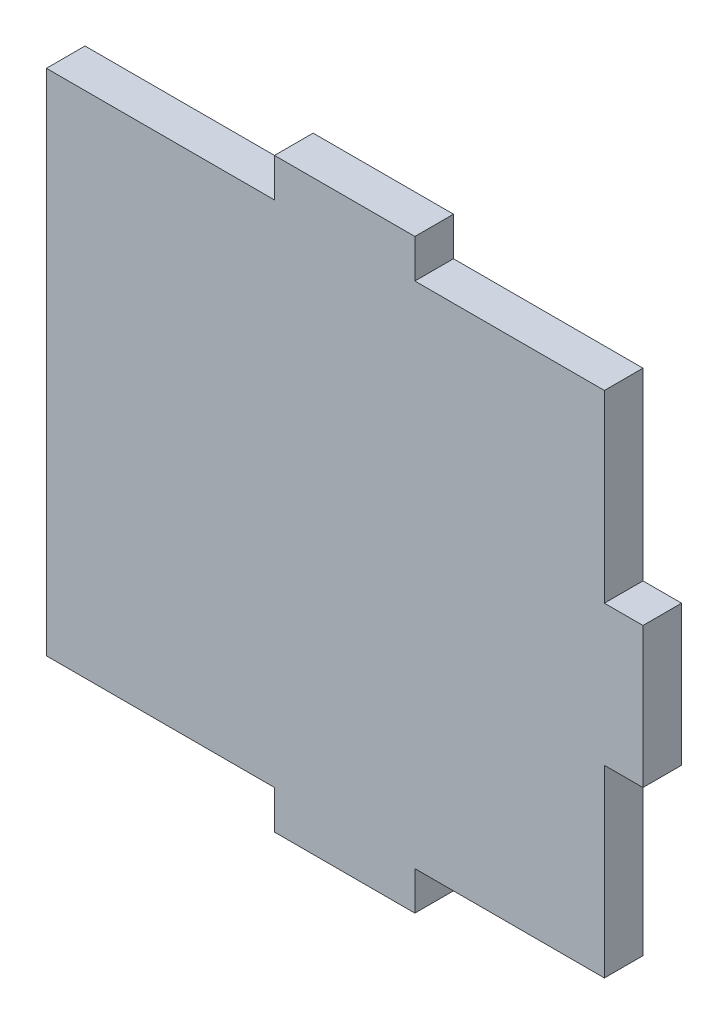
ISO-10303-21;
HEADER;
FILE_DESCRIPTION(('STEP AP214'),'2;1');
FILE_NAME('part.step','',(''),(''),'','','');
FILE_SCHEMA(('AUTOMOTIVE_DESIGN { 1 0 10303 214 1 1 1 1 }'));
ENDSEC;
DATA;
#1=APPLICATION_CONTEXT('core data for automotive mechanical design processes');
#2=APPLICATION_PROTOCOL_DEFINITION('international standard','automotive_design',2000,#1);
#3=PRODUCT_CONTEXT('',#1,'mechanical');
#4=PRODUCT('Part','Part','',(#3));
#5=PRODUCT_RELATED_PRODUCT_CATEGORY('part','',(#4));
#6=PRODUCT_DEFINITION_FORMATION('','',#4);
#7=PRODUCT_DEFINITION_CONTEXT('part definition',#1,'design');
#8=PRODUCT_DEFINITION('design','',#6,#7);
#9=PRODUCT_DEFINITION_SHAPE('','',#8);
#10=(LENGTH_UNIT() NAMED_UNIT(*) SI_UNIT(.MILLI.,.METRE.));
#11=(NAMED_UNIT(*) PLANE_ANGLE_UNIT() SI_UNIT($,.RADIAN.));
#12=(NAMED_UNIT(*) SI_UNIT($,.STERADIAN.) SOLID_ANGLE_UNIT());
#13=UNCERTAINTY_MEASURE_WITH_UNIT(LENGTH_MEASURE(1.E-05),#10,'distance_accuracy_value','');
#14=(GEOMETRIC_REPRESENTATION_CONTEXT(3) GLOBAL_UNCERTAINTY_ASSIGNED_CONTEXT((#13)) GLOBAL_UNIT_ASSIGNED_CONTEXT((#10,
#11,#12)) REPRESENTATION_CONTEXT('',''));
#15=CARTESIAN_POINT('',(0.,0.,0.));
#16=DIRECTION('',(0.,0.,1.));
#17=DIRECTION('',(1.,0.,0.));
#18=AXIS2_PLACEMENT_3D('',#15,#16,#17);
#19=CARTESIAN_POINT('',(-65.492187851568,60.6144721906924,5.5));
#20=DIRECTION('',(1.,0.,0.));
#21=DIRECTION('',(0.,1.,0.));
#22=AXIS2_PLACEMENT_3D('',#19,#20,#21);
#23=PLANE('',#22);
#24=DIRECTION('',(0.,-1.,0.));
#25=VECTOR('',#24,1.);
#26=CARTESIAN_POINT('',(-65.492187851568,60.6144721906924,0.));
#27=LINE('',#26,#25);
#28=CARTESIAN_POINT('',(-65.492187851568,60.6144721906924,0.));
#29=VERTEX_POINT('',#28);
#30=CARTESIAN_POINT('',(-65.492187851568,-11.8855278093076,0.));
#31=VERTEX_POINT('',#30);
#32=EDGE_CURVE('E175',#29,#31,#27,.T.);
#33=ORIENTED_EDGE('',*,*,#32,.T.);
#34=DIRECTION('',(0.,0.,-1.));
#35=VECTOR('',#34,1.);
#36=CARTESIAN_POINT('',(-65.492187851568,-11.8855278093076,5.5));
#37=LINE('',#36,#35);
#38=CARTESIAN_POINT('',(-65.492187851568,-11.8855278093076,5.5));
#39=VERTEX_POINT('',#38);
#40=EDGE_CURVE('E11',#39,#31,#37,.T.);
#41=ORIENTED_EDGE('',*,*,#40,.F.);
#42=DIRECTION('',(0.,-1.,0.));
#43=VECTOR('',#42,1.);
#44=CARTESIAN_POINT('',(-65.492187851568,60.6144721906924,5.5));
#45=LINE('',#44,#43);
#46=CARTESIAN_POINT('',(-65.492187851568,60.6144721906924,5.5));
#47=VERTEX_POINT('',#46);
#48=EDGE_CURVE('E207',#47,#39,#45,.T.);
#49=ORIENTED_EDGE('',*,*,#48,.F.);
#50=DIRECTION('',(0.,0.,-1.));
#51=VECTOR('',#50,1.);
#52=CARTESIAN_POINT('',(-65.492187851568,60.6144721906924,5.5));
#53=LINE('',#52,#51);
#54=EDGE_CURVE('E171',#47,#29,#53,.T.);
#55=ORIENTED_EDGE('',*,*,#54,.T.);
#56=EDGE_LOOP('',(#33,#41,#49,#55));
#57=FACE_BOUND('',#56,.T.);
#58=ADVANCED_FACE('F32',(#57),#23,.F.);
#59=CARTESIAN_POINT('',(-65.492187851568,-11.8855278093076,5.5));
#60=DIRECTION('',(0.,1.,0.));
#61=DIRECTION('',(0.,0.,1.));
#62=AXIS2_PLACEMENT_3D('',#59,#60,#61);
#63=PLANE('',#62);
#64=DIRECTION('',(1.,0.,0.));
#65=VECTOR('',#64,1.);
#66=CARTESIAN_POINT('',(-65.492187851568,-11.8855278093076,0.));
#67=LINE('',#66,#65);
#68=CARTESIAN_POINT('',(-32.992187851568,-11.8855278093076,0.));
#69=VERTEX_POINT('',#68);
#70=EDGE_CURVE('E178',#31,#69,#67,.T.);
#71=ORIENTED_EDGE('',*,*,#70,.T.);
#72=DIRECTION('',(0.,0.,-1.));
#73=VECTOR('',#72,1.);
#74=CARTESIAN_POINT('',(-32.992187851568,-11.8855278093076,5.5));
#75=LINE('',#74,#73);
#76=CARTESIAN_POINT('',(-32.992187851568,-11.8855278093076,5.5));
#77=VERTEX_POINT('',#76);
#78=EDGE_CURVE('E40',#77,#69,#75,.T.);
#79=ORIENTED_EDGE('',*,*,#78,.F.);
#80=DIRECTION('',(1.,0.,0.));
#81=VECTOR('',#80,1.);
#82=CARTESIAN_POINT('',(-65.492187851568,-11.8855278093076,5.5));
#83=LINE('',#82,#81);
#84=EDGE_CURVE('E115',#39,#77,#83,.T.);
#85=ORIENTED_EDGE('',*,*,#84,.F.);
#86=ORIENTED_EDGE('',*,*,#40,.T.);
#87=EDGE_LOOP('',(#71,#79,#85,#86));
#88=FACE_BOUND('',#87,.T.);
#89=ADVANCED_FACE('F305',(#88),#63,.F.);
#90=CARTESIAN_POINT('',(-32.992187851568,-11.8855278093076,5.5));
#91=DIRECTION('',(1.,0.,0.));
#92=DIRECTION('',(0.,0.,-1.));
#93=AXIS2_PLACEMENT_3D('',#90,#91,#92);
#94=PLANE('',#93);
#95=DIRECTION('',(0.,-1.,0.));
#96=VECTOR('',#95,1.);
#97=CARTESIAN_POINT('',(-32.992187851568,-11.8855278093076,0.));
#98=LINE('',#97,#96);
#99=CARTESIAN_POINT('',(-32.992187851568,-17.3855278093076,0.));
#100=VERTEX_POINT('',#99);
#101=EDGE_CURVE('E180',#69,#100,#98,.T.);
#102=ORIENTED_EDGE('',*,*,#101,.T.);
#103=DIRECTION('',(0.,0.,-1.));
#104=VECTOR('',#103,1.);
#105=CARTESIAN_POINT('',(-32.992187851568,-17.3855278093076,5.5));
#106=LINE('',#105,#104);
#107=CARTESIAN_POINT('',(-32.992187851568,-17.3855278093076,5.5));
#108=VERTEX_POINT('',#107);
#109=EDGE_CURVE('E238',#108,#100,#106,.T.);
#110=ORIENTED_EDGE('',*,*,#109,.F.);
#111=DIRECTION('',(0.,-1.,0.));
#112=VECTOR('',#111,1.);
#113=CARTESIAN_POINT('',(-32.992187851568,-11.8855278093076,5.5));
#114=LINE('',#113,#112);
#115=EDGE_CURVE('E246',#77,#108,#114,.T.);
#116=ORIENTED_EDGE('',*,*,#115,.F.);
#117=ORIENTED_EDGE('',*,*,#78,.T.);
#118=EDGE_LOOP('',(#102,#110,#116,#117));
#119=FACE_BOUND('',#118,.T.);
#120=ADVANCED_FACE('F244',(#119),#94,.F.);
#121=CARTESIAN_POINT('',(-22.992187851568,-17.3855278093076,5.5));
#122=DIRECTION('',(0.,1.,0.));
#123=DIRECTION('',(0.,0.,1.));
#124=AXIS2_PLACEMENT_3D('',#121,#122,#123);
#125=PLANE('',#124);
#126=DIRECTION('',(1.,0.,0.));
#127=VECTOR('',#126,1.);
#128=CARTESIAN_POINT('',(-22.992187851568,-17.3855278093076,0.));
#129=LINE('',#128,#127);
#130=CARTESIAN_POINT('',(-12.992187851568,-17.3855278093076,0.));
#131=VERTEX_POINT('',#130);
#132=EDGE_CURVE('E183',#100,#131,#129,.T.);
#133=ORIENTED_EDGE('',*,*,#132,.T.);
#134=DIRECTION('',(0.,0.,-1.));
#135=VECTOR('',#134,1.);
#136=CARTESIAN_POINT('',(-12.992187851568,-17.3855278093076,5.5));
#137=LINE('',#136,#135);
#138=CARTESIAN_POINT('',(-12.992187851568,-17.3855278093076,5.5));
#139=VERTEX_POINT('',#138);
#140=EDGE_CURVE('E235',#139,#131,#137,.T.);
#141=ORIENTED_EDGE('',*,*,#140,.F.);
#142=DIRECTION('',(1.,0.,0.));
#143=VECTOR('',#142,1.);
#144=CARTESIAN_POINT('',(-32.992187851568,-17.3855278093076,5.5));
#145=LINE('',#144,#143);
#146=EDGE_CURVE('E263',#108,#139,#145,.T.);
#147=ORIENTED_EDGE('',*,*,#146,.F.);
#148=ORIENTED_EDGE('',*,*,#109,.T.);
#149=EDGE_LOOP('',(#133,#141,#147,#148));
#150=FACE_BOUND('',#149,.T.);
#151=ADVANCED_FACE('F254',(#150),#125,.F.);
#152=CARTESIAN_POINT('',(-12.992187851568,-17.3855278093076,5.5));
#153=DIRECTION('',(-1.,0.,0.));
#154=DIRECTION('',(0.,-1.,0.));
#155=AXIS2_PLACEMENT_3D('',#152,#153,#154);
#156=PLANE('',#155);
#157=DIRECTION('',(0.,1.,0.));
#158=VECTOR('',#157,1.);
#159=CARTESIAN_POINT('',(-12.992187851568,-17.3855278093076,0.));
#160=LINE('',#159,#158);
#161=CARTESIAN_POINT('',(-12.992187851568,-11.8855278093076,0.));
#162=VERTEX_POINT('',#161);
#163=EDGE_CURVE('E185',#131,#162,#160,.T.);
#164=ORIENTED_EDGE('',*,*,#163,.T.);
#165=DIRECTION('',(0.,0.,-1.));
#166=VECTOR('',#165,1.);
#167=CARTESIAN_POINT('',(-12.992187851568,-11.8855278093076,5.5));
#168=LINE('',#167,#166);
#169=CARTESIAN_POINT('',(-12.992187851568,-11.8855278093076,5.5));
#170=VERTEX_POINT('',#169);
#171=EDGE_CURVE('E232',#170,#162,#168,.T.);
#172=ORIENTED_EDGE('',*,*,#171,.F.);
#173=DIRECTION('',(0.,1.,0.));
#174=VECTOR('',#173,1.);
#175=CARTESIAN_POINT('',(-12.992187851568,-17.3855278093076,5.5));
#176=LINE('',#175,#174);
#177=EDGE_CURVE('E260',#139,#170,#176,.T.);
#178=ORIENTED_EDGE('',*,*,#177,.F.);
#179=ORIENTED_EDGE('',*,*,#140,.T.);
#180=EDGE_LOOP('',(#164,#172,#178,#179));
#181=FACE_BOUND('',#180,.T.);
#182=ADVANCED_FACE('F258',(#181),#156,.F.);
#183=CARTESIAN_POINT('',(-12.992187851568,-11.8855278093076,5.5));
#184=DIRECTION('',(0.,1.,0.));
#185=DIRECTION('',(0.,0.,1.));
#186=AXIS2_PLACEMENT_3D('',#183,#184,#185);
#187=PLANE('',#186);
#188=DIRECTION('',(1.,0.,0.));
#189=VECTOR('',#188,1.);
#190=CARTESIAN_POINT('',(-12.992187851568,-11.8855278093076,0.));
#191=LINE('',#190,#189);
#192=CARTESIAN_POINT('',(14.007812148432,-11.8855278093076,0.));
#193=VERTEX_POINT('',#192);
#194=EDGE_CURVE('E187',#162,#193,#191,.T.);
#195=ORIENTED_EDGE('',*,*,#194,.T.);
#196=DIRECTION('',(0.,0.,-1.));
#197=VECTOR('',#196,1.);
#198=CARTESIAN_POINT('',(14.007812148432,-11.8855278093076,5.5));
#199=LINE('',#198,#197);
#200=CARTESIAN_POINT('',(14.007812148432,-11.8855278093076,5.5));
#201=VERTEX_POINT('',#200);
#202=EDGE_CURVE('E229',#201,#193,#199,.T.);
#203=ORIENTED_EDGE('',*,*,#202,.F.);
#204=DIRECTION('',(1.,0.,0.));
#205=VECTOR('',#204,1.);
#206=CARTESIAN_POINT('',(-12.992187851568,-11.8855278093076,5.5));
#207=LINE('',#206,#205);
#208=EDGE_CURVE('E262',#170,#201,#207,.T.);
#209=ORIENTED_EDGE('',*,*,#208,.F.);
#210=ORIENTED_EDGE('',*,*,#171,.T.);
#211=EDGE_LOOP('',(#195,#203,#209,#210));
#212=FACE_BOUND('',#211,.T.);
#213=ADVANCED_FACE('F318',(#212),#187,.F.);
#214=CARTESIAN_POINT('',(14.007812148432,14.3644721906924,5.5));
#215=DIRECTION('',(-1.,0.,0.));
#216=DIRECTION('',(0.,-1.,0.));
#217=AXIS2_PLACEMENT_3D('',#214,#215,#216);
#218=PLANE('',#217);
#219=DIRECTION('',(0.,1.,0.));
#220=VECTOR('',#219,1.);
#221=CARTESIAN_POINT('',(14.007812148432,14.3644721906924,0.));
#222=LINE('',#221,#220);
#223=CARTESIAN_POINT('',(14.007812148432,14.3644721906924,0.));
#224=VERTEX_POINT('',#223);
#225=EDGE_CURVE('E189',#193,#224,#222,.T.);
#226=ORIENTED_EDGE('',*,*,#225,.T.);
#227=DIRECTION('',(0.,0.,-1.));
#228=VECTOR('',#227,1.);
#229=CARTESIAN_POINT('',(14.007812148432,14.3644721906924,5.5));
#230=LINE('',#229,#228);
#231=CARTESIAN_POINT('',(14.007812148432,14.3644721906924,5.5));
#232=VERTEX_POINT('',#231);
#233=EDGE_CURVE('E226',#232,#224,#230,.T.);
#234=ORIENTED_EDGE('',*,*,#233,.F.);
#235=DIRECTION('',(0.,1.,0.));
#236=VECTOR('',#235,1.);
#237=CARTESIAN_POINT('',(14.007812148432,14.3644721906924,5.5));
#238=LINE('',#237,#236);
#239=EDGE_CURVE('E265',#201,#232,#238,.T.);
#240=ORIENTED_EDGE('',*,*,#239,.F.);
#241=ORIENTED_EDGE('',*,*,#202,.T.);
#242=EDGE_LOOP('',(#226,#234,#240,#241));
#243=FACE_BOUND('',#242,.T.);
#244=ADVANCED_FACE('F321',(#243),#218,.F.);
#245=CARTESIAN_POINT('',(14.007812148432,14.3644721906924,5.5));
#246=DIRECTION('',(0.,1.,0.));
#247=DIRECTION('',(0.,0.,1.));
#248=AXIS2_PLACEMENT_3D('',#245,#246,#247);
#249=PLANE('',#248);
#250=DIRECTION('',(1.,0.,0.));
#251=VECTOR('',#250,1.);
#252=CARTESIAN_POINT('',(14.007812148432,14.3644721906924,0.));
#253=LINE('',#252,#251);
#254=CARTESIAN_POINT('',(19.507812148432,14.3644721906924,0.));
#255=VERTEX_POINT('',#254);
#256=EDGE_CURVE('E191',#224,#255,#253,.T.);
#257=ORIENTED_EDGE('',*,*,#256,.T.);
#258=DIRECTION('',(0.,0.,-1.));
#259=VECTOR('',#258,1.);
#260=CARTESIAN_POINT('',(19.507812148432,14.3644721906924,5.5));
#261=LINE('',#260,#259);
#262=CARTESIAN_POINT('',(19.507812148432,14.3644721906924,5.5));
#263=VERTEX_POINT('',#262);
#264=EDGE_CURVE('E223',#263,#255,#261,.T.);
#265=ORIENTED_EDGE('',*,*,#264,.F.);
#266=DIRECTION('',(1.,0.,0.));
#267=VECTOR('',#266,1.);
#268=CARTESIAN_POINT('',(14.007812148432,14.3644721906924,5.5));
#269=LINE('',#268,#267);
#270=EDGE_CURVE('E271',#232,#263,#269,.T.);
#271=ORIENTED_EDGE('',*,*,#270,.F.);
#272=ORIENTED_EDGE('',*,*,#233,.T.);
#273=EDGE_LOOP('',(#257,#265,#271,#272));
#274=FACE_BOUND('',#273,.T.);
#275=ADVANCED_FACE('F325',(#274),#249,.F.);
#276=CARTESIAN_POINT('',(19.507812148432,34.3644721906924,5.5));
#277=DIRECTION('',(-1.,0.,0.));
#278=DIRECTION('',(0.,-1.,0.));
#279=AXIS2_PLACEMENT_3D('',#276,#277,#278);
#280=PLANE('',#279);
#281=DIRECTION('',(0.,1.,0.));
#282=VECTOR('',#281,1.);
#283=CARTESIAN_POINT('',(19.507812148432,34.3644721906924,0.));
#284=LINE('',#283,#282);
#285=CARTESIAN_POINT('',(19.507812148432,34.3644721906924,0.));
#286=VERTEX_POINT('',#285);
#287=EDGE_CURVE('E193',#255,#286,#284,.T.);
#288=ORIENTED_EDGE('',*,*,#287,.T.);
#289=DIRECTION('',(0.,0.,-1.));
#290=VECTOR('',#289,1.);
#291=CARTESIAN_POINT('',(19.507812148432,34.3644721906924,5.5));
#292=LINE('',#291,#290);
#293=CARTESIAN_POINT('',(19.507812148432,34.3644721906924,5.5));
#294=VERTEX_POINT('',#293);
#295=EDGE_CURVE('E220',#294,#286,#292,.T.);
#296=ORIENTED_EDGE('',*,*,#295,.F.);
#297=DIRECTION('',(0.,1.,0.));
#298=VECTOR('',#297,1.);
#299=CARTESIAN_POINT('',(19.507812148432,34.3644721906924,5.5));
#300=LINE('',#299,#298);
#301=EDGE_CURVE('E273',#263,#294,#300,.T.);
#302=ORIENTED_EDGE('',*,*,#301,.F.);
#303=ORIENTED_EDGE('',*,*,#264,.T.);
#304=EDGE_LOOP('',(#288,#296,#302,#303));
#305=FACE_BOUND('',#304,.T.);
#306=ADVANCED_FACE('F329',(#305),#280,.F.);
#307=CARTESIAN_POINT('',(14.007812148432,34.3644721906924,5.5));
#308=DIRECTION('',(0.,-1.,0.));
#309=DIRECTION('',(0.,0.,-1.));
#310=AXIS2_PLACEMENT_3D('',#307,#308,#309);
#311=PLANE('',#310);
#312=DIRECTION('',(-1.,0.,0.));
#313=VECTOR('',#312,1.);
#314=CARTESIAN_POINT('',(14.007812148432,34.3644721906924,0.));
#315=LINE('',#314,#313);
#316=CARTESIAN_POINT('',(14.007812148432,34.3644721906924,0.));
#317=VERTEX_POINT('',#316);
#318=EDGE_CURVE('E195',#286,#317,#315,.T.);
#319=ORIENTED_EDGE('',*,*,#318,.T.);
#320=DIRECTION('',(0.,0.,-1.));
#321=VECTOR('',#320,1.);
#322=CARTESIAN_POINT('',(14.007812148432,34.3644721906924,5.5));
#323=LINE('',#322,#321);
#324=CARTESIAN_POINT('',(14.007812148432,34.3644721906924,5.5));
#325=VERTEX_POINT('',#324);
#326=EDGE_CURVE('E217',#325,#317,#323,.T.);
#327=ORIENTED_EDGE('',*,*,#326,.F.);
#328=DIRECTION('',(-1.,0.,0.));
#329=VECTOR('',#328,1.);
#330=CARTESIAN_POINT('',(14.007812148432,34.3644721906924,5.5));
#331=LINE('',#330,#329);
#332=EDGE_CURVE('E275',#294,#325,#331,.T.);
#333=ORIENTED_EDGE('',*,*,#332,.F.);
#334=ORIENTED_EDGE('',*,*,#295,.T.);
#335=EDGE_LOOP('',(#319,#327,#333,#334));
#336=FACE_BOUND('',#335,.T.);
#337=ADVANCED_FACE('F333',(#336),#311,.F.);
#338=CARTESIAN_POINT('',(14.007812148432,60.6144721906924,5.5));
#339=DIRECTION('',(-1.,0.,0.));
#340=DIRECTION('',(0.,-1.,0.));
#341=AXIS2_PLACEMENT_3D('',#338,#339,#340);
#342=PLANE('',#341);
#343=DIRECTION('',(0.,1.,0.));
#344=VECTOR('',#343,1.);
#345=CARTESIAN_POINT('',(14.007812148432,60.6144721906924,0.));
#346=LINE('',#345,#344);
#347=CARTESIAN_POINT('',(14.007812148432,60.6144721906924,0.));
#348=VERTEX_POINT('',#347);
#349=EDGE_CURVE('E197',#317,#348,#346,.T.);
#350=ORIENTED_EDGE('',*,*,#349,.T.);
#351=DIRECTION('',(0.,0.,-1.));
#352=VECTOR('',#351,1.);
#353=CARTESIAN_POINT('',(14.007812148432,60.6144721906924,5.5));
#354=LINE('',#353,#352);
#355=CARTESIAN_POINT('',(14.007812148432,60.6144721906924,5.5));
#356=VERTEX_POINT('',#355);
#357=EDGE_CURVE('E214',#356,#348,#354,.T.);
#358=ORIENTED_EDGE('',*,*,#357,.F.);
#359=DIRECTION('',(0.,1.,0.));
#360=VECTOR('',#359,1.);
#361=CARTESIAN_POINT('',(14.007812148432,60.6144721906924,5.5));
#362=LINE('',#361,#360);
#363=EDGE_CURVE('E277',#325,#356,#362,.T.);
#364=ORIENTED_EDGE('',*,*,#363,.F.);
#365=ORIENTED_EDGE('',*,*,#326,.T.);
#366=EDGE_LOOP('',(#350,#358,#364,#365));
#367=FACE_BOUND('',#366,.T.);
#368=ADVANCED_FACE('F337',(#367),#342,.F.);
#369=CARTESIAN_POINT('',(-12.992187851568,60.6144721906924,5.5));
#370=DIRECTION('',(0.,-1.,0.));
#371=DIRECTION('',(0.,0.,-1.));
#372=AXIS2_PLACEMENT_3D('',#369,#370,#371);
#373=PLANE('',#372);
#374=DIRECTION('',(-1.,0.,0.));
#375=VECTOR('',#374,1.);
#376=CARTESIAN_POINT('',(-12.992187851568,60.6144721906924,0.));
#377=LINE('',#376,#375);
#378=CARTESIAN_POINT('',(-12.992187851568,60.6144721906924,0.));
#379=VERTEX_POINT('',#378);
#380=EDGE_CURVE('E199',#348,#379,#377,.T.);
#381=ORIENTED_EDGE('',*,*,#380,.T.);
#382=DIRECTION('',(0.,0.,-1.));
#383=VECTOR('',#382,1.);
#384=CARTESIAN_POINT('',(-12.992187851568,60.6144721906924,5.5));
#385=LINE('',#384,#383);
#386=CARTESIAN_POINT('',(-12.992187851568,60.6144721906924,5.5));
#387=VERTEX_POINT('',#386);
#388=EDGE_CURVE('E211',#387,#379,#385,.T.);
#389=ORIENTED_EDGE('',*,*,#388,.F.);
#390=DIRECTION('',(-1.,0.,0.));
#391=VECTOR('',#390,1.);
#392=CARTESIAN_POINT('',(-12.992187851568,60.6144721906924,5.5));
#393=LINE('',#392,#391);
#394=EDGE_CURVE('E279',#356,#387,#393,.T.);
#395=ORIENTED_EDGE('',*,*,#394,.F.);
#396=ORIENTED_EDGE('',*,*,#357,.T.);
#397=EDGE_LOOP('',(#381,#389,#395,#396));
#398=FACE_BOUND('',#397,.T.);
#399=ADVANCED_FACE('F285',(#398),#373,.F.);
#400=CARTESIAN_POINT('',(-12.992187851568,66.1144721906924,5.5));
#401=DIRECTION('',(-1.,0.,0.));
#402=DIRECTION('',(0.,0.,1.));
#403=AXIS2_PLACEMENT_3D('',#400,#401,#402);
#404=PLANE('',#403);
#405=DIRECTION('',(0.,1.,0.));
#406=VECTOR('',#405,1.);
#407=CARTESIAN_POINT('',(-12.992187851568,66.1144721906924,0.));
#408=LINE('',#407,#406);
#409=CARTESIAN_POINT('',(-12.992187851568,66.1144721906924,0.));
#410=VERTEX_POINT('',#409);
#411=EDGE_CURVE('E201',#379,#410,#408,.T.);
#412=ORIENTED_EDGE('',*,*,#411,.T.);
#413=DIRECTION('',(0.,0.,-1.));
#414=VECTOR('',#413,1.);
#415=CARTESIAN_POINT('',(-12.992187851568,66.1144721906924,5.5));
#416=LINE('',#415,#414);
#417=CARTESIAN_POINT('',(-12.992187851568,66.1144721906924,5.5));
#418=VERTEX_POINT('',#417);
#419=EDGE_CURVE('E166',#418,#410,#416,.T.);
#420=ORIENTED_EDGE('',*,*,#419,.F.);
#421=DIRECTION('',(0.,1.,0.));
#422=VECTOR('',#421,1.);
#423=CARTESIAN_POINT('',(-12.992187851568,66.1144721906924,5.5));
#424=LINE('',#423,#422);
#425=EDGE_CURVE('E158',#387,#418,#424,.T.);
#426=ORIENTED_EDGE('',*,*,#425,.F.);
#427=ORIENTED_EDGE('',*,*,#388,.T.);
#428=EDGE_LOOP('',(#412,#420,#426,#427));
#429=FACE_BOUND('',#428,.T.);
#430=ADVANCED_FACE('F289',(#429),#404,.F.);
#431=CARTESIAN_POINT('',(-32.992187851568,66.1144721906924,5.5));
#432=DIRECTION('',(0.,-1.,0.));
#433=DIRECTION('',(0.,0.,-1.));
#434=AXIS2_PLACEMENT_3D('',#431,#432,#433);
#435=PLANE('',#434);
#436=DIRECTION('',(-1.,0.,0.));
#437=VECTOR('',#436,1.);
#438=CARTESIAN_POINT('',(-32.992187851568,66.1144721906924,0.));
#439=LINE('',#438,#437);
#440=CARTESIAN_POINT('',(-32.992187851568,66.1144721906924,0.));
#441=VERTEX_POINT('',#440);
#442=EDGE_CURVE('E165',#410,#441,#439,.T.);
#443=ORIENTED_EDGE('',*,*,#442,.T.);
#444=DIRECTION('',(0.,0.,-1.));
#445=VECTOR('',#444,1.);
#446=CARTESIAN_POINT('',(-32.992187851568,66.1144721906924,5.5));
#447=LINE('',#446,#445);
#448=CARTESIAN_POINT('',(-32.992187851568,66.1144721906924,5.5));
#449=VERTEX_POINT('',#448);
#450=EDGE_CURVE('E163',#449,#441,#447,.T.);
#451=ORIENTED_EDGE('',*,*,#450,.F.);
#452=DIRECTION('',(-1.,0.,0.));
#453=VECTOR('',#452,1.);
#454=CARTESIAN_POINT('',(-22.992187851568,66.1144721906924,5.5));
#455=LINE('',#454,#453);
#456=EDGE_CURVE('E152',#418,#449,#455,.T.);
#457=ORIENTED_EDGE('',*,*,#456,.F.);
#458=ORIENTED_EDGE('',*,*,#419,.T.);
#459=EDGE_LOOP('',(#443,#451,#457,#458));
#460=FACE_BOUND('',#459,.T.);
#461=ADVANCED_FACE('F164',(#460),#435,.F.);
#462=CARTESIAN_POINT('',(-32.992187851568,60.6144721906924,5.5));
#463=DIRECTION('',(1.,0.,0.));
#464=DIRECTION('',(0.,0.,-1.));
#465=AXIS2_PLACEMENT_3D('',#462,#463,#464);
#466=PLANE('',#465);
#467=DIRECTION('',(0.,-1.,0.));
#468=VECTOR('',#467,1.);
#469=CARTESIAN_POINT('',(-32.992187851568,60.6144721906924,0.));
#470=LINE('',#469,#468);
#471=CARTESIAN_POINT('',(-32.992187851568,60.6144721906924,0.));
#472=VERTEX_POINT('',#471);
#473=EDGE_CURVE('E101',#441,#472,#470,.T.);
#474=ORIENTED_EDGE('',*,*,#473,.T.);
#475=DIRECTION('',(0.,0.,-1.));
#476=VECTOR('',#475,1.);
#477=CARTESIAN_POINT('',(-32.992187851568,60.6144721906924,5.5));
#478=LINE('',#477,#476);
#479=CARTESIAN_POINT('',(-32.992187851568,60.6144721906924,5.5));
#480=VERTEX_POINT('',#479);
#481=EDGE_CURVE('E167',#480,#472,#478,.T.);
#482=ORIENTED_EDGE('',*,*,#481,.F.);
#483=DIRECTION('',(0.,-1.,0.));
#484=VECTOR('',#483,1.);
#485=CARTESIAN_POINT('',(-32.992187851568,60.6144721906924,5.5));
#486=LINE('',#485,#484);
#487=EDGE_CURVE('E156',#449,#480,#486,.T.);
#488=ORIENTED_EDGE('',*,*,#487,.F.);
#489=ORIENTED_EDGE('',*,*,#450,.T.);
#490=EDGE_LOOP('',(#474,#482,#488,#489));
#491=FACE_BOUND('',#490,.T.);
#492=ADVANCED_FACE('F169',(#491),#466,.F.);
#493=CARTESIAN_POINT('',(-65.492187851568,60.6144721906924,5.5));
#494=DIRECTION('',(0.,-1.,0.));
#495=DIRECTION('',(0.,0.,-1.));
#496=AXIS2_PLACEMENT_3D('',#493,#494,#495);
#497=PLANE('',#496);
#498=DIRECTION('',(-1.,0.,0.));
#499=VECTOR('',#498,1.);
#500=CARTESIAN_POINT('',(-65.492187851568,60.6144721906924,0.));
#501=LINE('',#500,#499);
#502=EDGE_CURVE('E107',#472,#29,#501,.T.);
#503=ORIENTED_EDGE('',*,*,#502,.T.);
#504=ORIENTED_EDGE('',*,*,#54,.F.);
#505=DIRECTION('',(-1.,0.,0.));
#506=VECTOR('',#505,1.);
#507=CARTESIAN_POINT('',(-65.492187851568,60.6144721906924,5.5));
#508=LINE('',#507,#506);
#509=EDGE_CURVE('E48',#480,#47,#508,.T.);
#510=ORIENTED_EDGE('',*,*,#509,.F.);
#511=ORIENTED_EDGE('',*,*,#481,.T.);
#512=EDGE_LOOP('',(#503,#504,#510,#511));
#513=FACE_BOUND('',#512,.T.);
#514=ADVANCED_FACE('F294',(#513),#497,.F.);
#515=CARTESIAN_POINT('',(0.,0.,5.5));
#516=DIRECTION('',(0.,0.,1.));
#517=DIRECTION('',(1.,0.,0.));
#518=AXIS2_PLACEMENT_3D('',#515,#516,#517);
#519=PLANE('',#518);
#520=ORIENTED_EDGE('',*,*,#48,.T.);
#521=ORIENTED_EDGE('',*,*,#84,.T.);
#522=ORIENTED_EDGE('',*,*,#115,.T.);
#523=ORIENTED_EDGE('',*,*,#146,.T.);
#524=ORIENTED_EDGE('',*,*,#177,.T.);
#525=ORIENTED_EDGE('',*,*,#208,.T.);
#526=ORIENTED_EDGE('',*,*,#239,.T.);
#527=ORIENTED_EDGE('',*,*,#270,.T.);
#528=ORIENTED_EDGE('',*,*,#301,.T.);
#529=ORIENTED_EDGE('',*,*,#332,.T.);
#530=ORIENTED_EDGE('',*,*,#363,.T.);
#531=ORIENTED_EDGE('',*,*,#394,.T.);
#532=ORIENTED_EDGE('',*,*,#425,.T.);
#533=ORIENTED_EDGE('',*,*,#456,.T.);
#534=ORIENTED_EDGE('',*,*,#487,.T.);
#535=ORIENTED_EDGE('',*,*,#509,.T.);
#536=EDGE_LOOP('',(#520,#521,#522,#523,#524,#525,#526,#527,#528,#529,#530,#531,#532,#533,#534,#535));
#537=FACE_BOUND('',#536,.T.);
#538=ADVANCED_FACE('F154',(#537),#519,.T.);
#539=CARTESIAN_POINT('',(0.,0.,0.));
#540=DIRECTION('',(0.,0.,1.));
#541=DIRECTION('',(1.,0.,0.));
#542=AXIS2_PLACEMENT_3D('',#539,#540,#541);
#543=PLANE('',#542);
#544=ORIENTED_EDGE('',*,*,#32,.F.);
#545=ORIENTED_EDGE('',*,*,#502,.F.);
#546=ORIENTED_EDGE('',*,*,#473,.F.);
#547=ORIENTED_EDGE('',*,*,#442,.F.);
#548=ORIENTED_EDGE('',*,*,#411,.F.);
#549=ORIENTED_EDGE('',*,*,#380,.F.);
#550=ORIENTED_EDGE('',*,*,#349,.F.);
#551=ORIENTED_EDGE('',*,*,#318,.F.);
#552=ORIENTED_EDGE('',*,*,#287,.F.);
#553=ORIENTED_EDGE('',*,*,#256,.F.);
#554=ORIENTED_EDGE('',*,*,#225,.F.);
#555=ORIENTED_EDGE('',*,*,#194,.F.);
#556=ORIENTED_EDGE('',*,*,#163,.F.);
#557=ORIENTED_EDGE('',*,*,#132,.F.);
#558=ORIENTED_EDGE('',*,*,#101,.F.);
#559=ORIENTED_EDGE('',*,*,#70,.F.);
#560=EDGE_LOOP('',(#544,#545,#546,#547,#548,#549,#550,#551,#552,#553,#554,#555,#556,#557,#558,#559));
#561=FACE_BOUND('',#560,.T.);
#562=ADVANCED_FACE('F249',(#561),#543,.F.);
#563=CLOSED_SHELL('',(#58,#89,#120,#151,#182,#213,#244,#275,#306,#337,#368,#399,#430,#461,#492,
#514,#538,#562));
#564=MANIFOLD_SOLID_BREP('B2',#563);
#565=ADVANCED_BREP_SHAPE_REPRESENTATION('',(#18,#564),#14);
#566=SHAPE_DEFINITION_REPRESENTATION(#9,#565);
ENDSEC;
END-ISO-10303-21;
